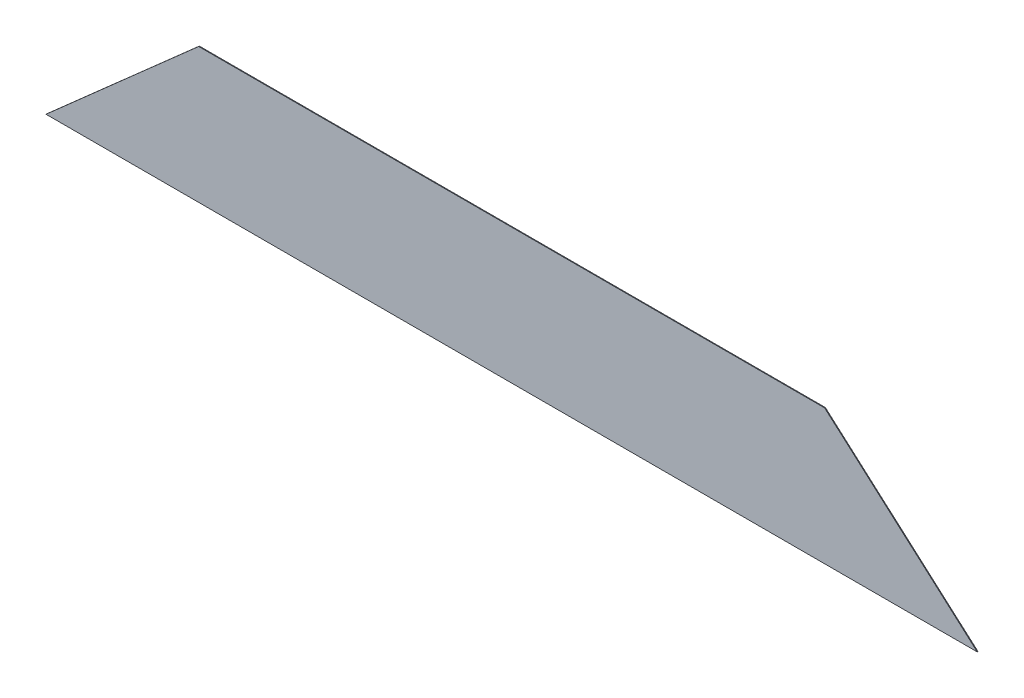
ISO-10303-21;
HEADER;
FILE_DESCRIPTION(('STEP AP214'),'2;1');
FILE_NAME('part.step','',(''),(''),'','','');
FILE_SCHEMA(('AUTOMOTIVE_DESIGN { 1 0 10303 214 1 1 1 1 }'));
ENDSEC;
DATA;
#1=APPLICATION_CONTEXT('core data for automotive mechanical design processes');
#2=APPLICATION_PROTOCOL_DEFINITION('international standard','automotive_design',2000,#1);
#3=PRODUCT_CONTEXT('',#1,'mechanical');
#4=PRODUCT('Part','Part','',(#3));
#5=PRODUCT_RELATED_PRODUCT_CATEGORY('part','',(#4));
#6=PRODUCT_DEFINITION_FORMATION('','',#4);
#7=PRODUCT_DEFINITION_CONTEXT('part definition',#1,'design');
#8=PRODUCT_DEFINITION('design','',#6,#7);
#9=PRODUCT_DEFINITION_SHAPE('','',#8);
#10=(LENGTH_UNIT() NAMED_UNIT(*) SI_UNIT(.MILLI.,.METRE.));
#11=(NAMED_UNIT(*) PLANE_ANGLE_UNIT() SI_UNIT($,.RADIAN.));
#12=(NAMED_UNIT(*) SI_UNIT($,.STERADIAN.) SOLID_ANGLE_UNIT());
#13=UNCERTAINTY_MEASURE_WITH_UNIT(LENGTH_MEASURE(1.E-05),#10,'distance_accuracy_value','');
#14=(GEOMETRIC_REPRESENTATION_CONTEXT(3) GLOBAL_UNCERTAINTY_ASSIGNED_CONTEXT((#13)) GLOBAL_UNIT_ASSIGNED_CONTEXT((#10,
#11,#12)) REPRESENTATION_CONTEXT('',''));
#15=CARTESIAN_POINT('',(0.,0.,0.));
#16=DIRECTION('',(0.,0.,1.));
#17=DIRECTION('',(1.,0.,0.));
#18=AXIS2_PLACEMENT_3D('',#15,#16,#17);
#19=CARTESIAN_POINT('',(-1050.4,-140.112293651185,-1.5875));
#20=DIRECTION('',(0.,-1.,0.));
#21=DIRECTION('',(0.,0.,-1.));
#22=AXIS2_PLACEMENT_3D('',#19,#20,#21);
#23=PLANE('',#22);
#24=DIRECTION('',(1.,0.,0.));
#25=VECTOR('',#24,1.);
#26=CARTESIAN_POINT('',(-1050.4,-140.112293651185,0.));
#27=LINE('',#26,#25);
#28=CARTESIAN_POINT('',(-1050.4,-140.112293651185,0.));
#29=VERTEX_POINT('',#28);
#30=CARTESIAN_POINT('',(1050.4,-140.112293651185,0.));
#31=VERTEX_POINT('',#30);
#32=EDGE_CURVE('E104',#29,#31,#27,.T.);
#33=ORIENTED_EDGE('',*,*,#32,.F.);
#34=DIRECTION('',(0.,0.,1.));
#35=VECTOR('',#34,1.);
#36=CARTESIAN_POINT('',(-1050.4,-140.112293651185,-1.5875));
#37=LINE('',#36,#35);
#38=CARTESIAN_POINT('',(-1050.4,-140.112293651185,-1.5875));
#39=VERTEX_POINT('',#38);
#40=EDGE_CURVE('E11',#39,#29,#37,.T.);
#41=ORIENTED_EDGE('',*,*,#40,.F.);
#42=DIRECTION('',(1.,0.,0.));
#43=VECTOR('',#42,1.);
#44=CARTESIAN_POINT('',(-1050.4,-140.112293651185,-1.5875));
#45=LINE('',#44,#43);
#46=CARTESIAN_POINT('',(1050.4,-140.112293651185,-1.5875));
#47=VERTEX_POINT('',#46);
#48=EDGE_CURVE('E98',#39,#47,#45,.T.);
#49=ORIENTED_EDGE('',*,*,#48,.T.);
#50=DIRECTION('',(0.,0.,1.));
#51=VECTOR('',#50,1.);
#52=CARTESIAN_POINT('',(1050.4,-140.112293651185,-1.5875));
#53=LINE('',#52,#51);
#54=EDGE_CURVE('E43',#47,#31,#53,.T.);
#55=ORIENTED_EDGE('',*,*,#54,.T.);
#56=EDGE_LOOP('',(#33,#41,#49,#55));
#57=FACE_BOUND('',#56,.T.);
#58=ADVANCED_FACE('F40',(#57),#23,.T.);
#59=CARTESIAN_POINT('',(-1050.4,-140.112293651185,-1.5875));
#60=DIRECTION('',(-0.662498792440241,0.749062981340837,0.));
#61=DIRECTION('',(-0.749062981340837,-0.662498792440241,0.));
#62=AXIS2_PLACEMENT_3D('',#59,#60,#61);
#63=PLANE('',#62);
#64=DIRECTION('',(-0.749062981340837,-0.662498792440241,0.));
#65=VECTOR('',#64,1.);
#66=CARTESIAN_POINT('',(-1050.4,-140.112293651185,0.));
#67=LINE('',#66,#65);
#68=CARTESIAN_POINT('',(-706.,164.487706348815,0.));
#69=VERTEX_POINT('',#68);
#70=EDGE_CURVE('E100',#69,#29,#67,.T.);
#71=ORIENTED_EDGE('',*,*,#70,.F.);
#72=DIRECTION('',(0.,0.,1.));
#73=VECTOR('',#72,1.);
#74=CARTESIAN_POINT('',(-706.,164.487706348815,-1.5875));
#75=LINE('',#74,#73);
#76=CARTESIAN_POINT('',(-706.,164.487706348815,-1.5875));
#77=VERTEX_POINT('',#76);
#78=EDGE_CURVE('E49',#77,#69,#75,.T.);
#79=ORIENTED_EDGE('',*,*,#78,.F.);
#80=DIRECTION('',(-0.749062981340837,-0.662498792440241,0.));
#81=VECTOR('',#80,1.);
#82=CARTESIAN_POINT('',(-1050.4,-140.112293651185,-1.5875));
#83=LINE('',#82,#81);
#84=EDGE_CURVE('E95',#77,#39,#83,.T.);
#85=ORIENTED_EDGE('',*,*,#84,.T.);
#86=ORIENTED_EDGE('',*,*,#40,.T.);
#87=EDGE_LOOP('',(#71,#79,#85,#86));
#88=FACE_BOUND('',#87,.T.);
#89=ADVANCED_FACE('F114',(#88),#63,.T.);
#90=CARTESIAN_POINT('',(-706.,164.487706348815,-1.5875));
#91=DIRECTION('',(0.,1.,0.));
#92=DIRECTION('',(-1.,0.,0.));
#93=AXIS2_PLACEMENT_3D('',#90,#91,#92);
#94=PLANE('',#93);
#95=DIRECTION('',(-1.,0.,0.));
#96=VECTOR('',#95,1.);
#97=CARTESIAN_POINT('',(-706.,164.487706348815,0.));
#98=LINE('',#97,#96);
#99=CARTESIAN_POINT('',(706.,164.487706348815,0.));
#100=VERTEX_POINT('',#99);
#101=EDGE_CURVE('E90',#100,#69,#98,.T.);
#102=ORIENTED_EDGE('',*,*,#101,.F.);
#103=DIRECTION('',(0.,0.,1.));
#104=VECTOR('',#103,1.);
#105=CARTESIAN_POINT('',(706.,164.487706348815,-1.5875));
#106=LINE('',#105,#104);
#107=CARTESIAN_POINT('',(706.,164.487706348815,-1.5875));
#108=VERTEX_POINT('',#107);
#109=EDGE_CURVE('E85',#108,#100,#106,.T.);
#110=ORIENTED_EDGE('',*,*,#109,.F.);
#111=DIRECTION('',(-1.,0.,0.));
#112=VECTOR('',#111,1.);
#113=CARTESIAN_POINT('',(-706.,164.487706348815,-1.5875));
#114=LINE('',#113,#112);
#115=EDGE_CURVE('E88',#108,#77,#114,.T.);
#116=ORIENTED_EDGE('',*,*,#115,.T.);
#117=ORIENTED_EDGE('',*,*,#78,.T.);
#118=EDGE_LOOP('',(#102,#110,#116,#117));
#119=FACE_BOUND('',#118,.T.);
#120=ADVANCED_FACE('F87',(#119),#94,.T.);
#121=CARTESIAN_POINT('',(706.,164.487706348815,-1.5875));
#122=DIRECTION('',(0.662498792440241,0.749062981340837,0.));
#123=DIRECTION('',(-0.749062981340837,0.662498792440241,0.));
#124=AXIS2_PLACEMENT_3D('',#121,#122,#123);
#125=PLANE('',#124);
#126=DIRECTION('',(-0.749062981340837,0.662498792440241,0.));
#127=VECTOR('',#126,1.);
#128=CARTESIAN_POINT('',(706.,164.487706348815,0.));
#129=LINE('',#128,#127);
#130=EDGE_CURVE('E107',#31,#100,#129,.T.);
#131=ORIENTED_EDGE('',*,*,#130,.F.);
#132=ORIENTED_EDGE('',*,*,#54,.F.);
#133=DIRECTION('',(-0.749062981340837,0.662498792440241,0.));
#134=VECTOR('',#133,1.);
#135=CARTESIAN_POINT('',(706.,164.487706348815,-1.5875));
#136=LINE('',#135,#134);
#137=EDGE_CURVE('E94',#47,#108,#136,.T.);
#138=ORIENTED_EDGE('',*,*,#137,.T.);
#139=ORIENTED_EDGE('',*,*,#109,.T.);
#140=EDGE_LOOP('',(#131,#132,#138,#139));
#141=FACE_BOUND('',#140,.T.);
#142=ADVANCED_FACE('F97',(#141),#125,.T.);
#143=CARTESIAN_POINT('',(0.,0.,-1.5875));
#144=DIRECTION('',(0.,0.,-1.));
#145=DIRECTION('',(-1.,0.,0.));
#146=AXIS2_PLACEMENT_3D('',#143,#144,#145);
#147=PLANE('',#146);
#148=ORIENTED_EDGE('',*,*,#48,.F.);
#149=ORIENTED_EDGE('',*,*,#84,.F.);
#150=ORIENTED_EDGE('',*,*,#115,.F.);
#151=ORIENTED_EDGE('',*,*,#137,.F.);
#152=EDGE_LOOP('',(#148,#149,#150,#151));
#153=FACE_BOUND('',#152,.T.);
#154=ADVANCED_FACE('F93',(#153),#147,.T.);
#155=CARTESIAN_POINT('',(0.,0.,0.));
#156=DIRECTION('',(0.,0.,-1.));
#157=DIRECTION('',(-1.,0.,0.));
#158=AXIS2_PLACEMENT_3D('',#155,#156,#157);
#159=PLANE('',#158);
#160=ORIENTED_EDGE('',*,*,#32,.T.);
#161=ORIENTED_EDGE('',*,*,#130,.T.);
#162=ORIENTED_EDGE('',*,*,#101,.T.);
#163=ORIENTED_EDGE('',*,*,#70,.T.);
#164=EDGE_LOOP('',(#160,#161,#162,#163));
#165=FACE_BOUND('',#164,.T.);
#166=ADVANCED_FACE('F113',(#165),#159,.F.);
#167=CLOSED_SHELL('',(#58,#89,#120,#142,#154,#166));
#168=MANIFOLD_SOLID_BREP('B2',#167);
#169=ADVANCED_BREP_SHAPE_REPRESENTATION('',(#18,#168),#14);
#170=SHAPE_DEFINITION_REPRESENTATION(#9,#169);
ENDSEC;
END-ISO-10303-21;
